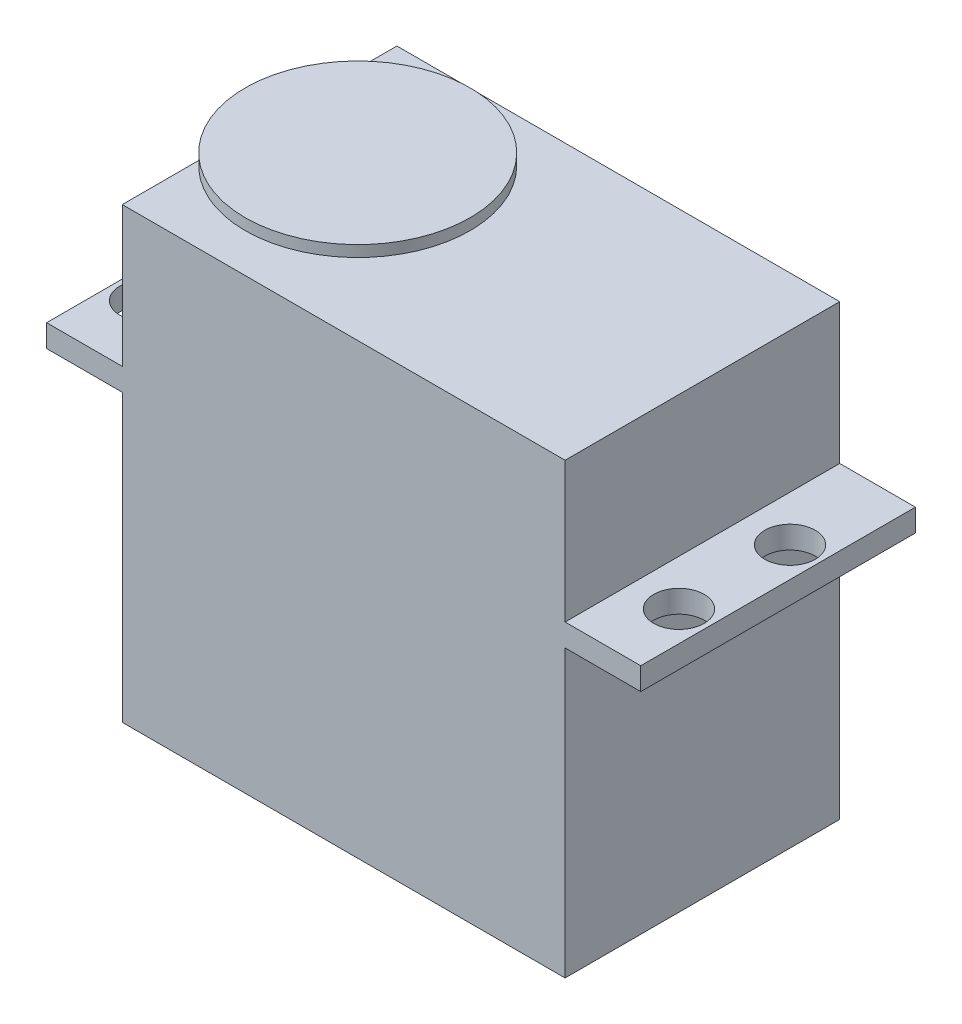
ISO-10303-21;
HEADER;
FILE_DESCRIPTION(('STEP AP214'),'2;1');
FILE_NAME('part.step','',(''),(''),'','','');
FILE_SCHEMA(('AUTOMOTIVE_DESIGN { 1 0 10303 214 1 1 1 1 }'));
ENDSEC;
DATA;
#1=APPLICATION_CONTEXT('core data for automotive mechanical design processes');
#2=APPLICATION_PROTOCOL_DEFINITION('international standard','automotive_design',2000,#1);
#3=PRODUCT_CONTEXT('',#1,'mechanical');
#4=PRODUCT('Part','Part','',(#3));
#5=PRODUCT_RELATED_PRODUCT_CATEGORY('part','',(#4));
#6=PRODUCT_DEFINITION_FORMATION('','',#4);
#7=PRODUCT_DEFINITION_CONTEXT('part definition',#1,'design');
#8=PRODUCT_DEFINITION('design','',#6,#7);
#9=PRODUCT_DEFINITION_SHAPE('','',#8);
#10=(LENGTH_UNIT() NAMED_UNIT(*) SI_UNIT(.MILLI.,.METRE.));
#11=(NAMED_UNIT(*) PLANE_ANGLE_UNIT() SI_UNIT($,.RADIAN.));
#12=(NAMED_UNIT(*) SI_UNIT($,.STERADIAN.) SOLID_ANGLE_UNIT());
#13=UNCERTAINTY_MEASURE_WITH_UNIT(LENGTH_MEASURE(1.E-05),#10,'distance_accuracy_value','');
#14=(GEOMETRIC_REPRESENTATION_CONTEXT(3) GLOBAL_UNCERTAINTY_ASSIGNED_CONTEXT((#13)) GLOBAL_UNIT_ASSIGNED_CONTEXT((#10,
#11,#12)) REPRESENTATION_CONTEXT('',''));
#15=CARTESIAN_POINT('',(0.,0.,0.));
#16=DIRECTION('',(0.,0.,1.));
#17=DIRECTION('',(1.,0.,0.));
#18=AXIS2_PLACEMENT_3D('',#15,#16,#17);
#19=CARTESIAN_POINT('',(-19.75,40.,-12.25));
#20=DIRECTION('',(1.,0.,0.));
#21=DIRECTION('',(0.,0.,-1.));
#22=AXIS2_PLACEMENT_3D('',#19,#20,#21);
#23=PLANE('',#22);
#24=DIRECTION('',(0.,0.,1.));
#25=VECTOR('',#24,1.);
#26=CARTESIAN_POINT('',(-19.75,25.5,-12.25));
#27=LINE('',#26,#25);
#28=CARTESIAN_POINT('',(-19.75,25.5,-12.25));
#29=VERTEX_POINT('',#28);
#30=CARTESIAN_POINT('',(-19.75,25.5,12.25));
#31=VERTEX_POINT('',#30);
#32=EDGE_CURVE('E143',#29,#31,#27,.T.);
#33=ORIENTED_EDGE('',*,*,#32,.F.);
#34=DIRECTION('',(0.,-1.,0.));
#35=VECTOR('',#34,1.);
#36=CARTESIAN_POINT('',(-19.75,40.,-12.25));
#37=LINE('',#36,#35);
#38=CARTESIAN_POINT('',(-19.75,0.,-12.25));
#39=VERTEX_POINT('',#38);
#40=EDGE_CURVE('E193',#29,#39,#37,.T.);
#41=ORIENTED_EDGE('',*,*,#40,.T.);
#42=DIRECTION('',(0.,0.,1.));
#43=VECTOR('',#42,1.);
#44=CARTESIAN_POINT('',(-19.75,0.,-12.25));
#45=LINE('',#44,#43);
#46=CARTESIAN_POINT('',(-19.75,0.,12.25));
#47=VERTEX_POINT('',#46);
#48=EDGE_CURVE('E182',#39,#47,#45,.T.);
#49=ORIENTED_EDGE('',*,*,#48,.T.);
#50=DIRECTION('',(0.,-1.,0.));
#51=VECTOR('',#50,1.);
#52=CARTESIAN_POINT('',(-19.75,40.,12.25));
#53=LINE('',#52,#51);
#54=EDGE_CURVE('E45',#31,#47,#53,.T.);
#55=ORIENTED_EDGE('',*,*,#54,.F.);
#56=EDGE_LOOP('',(#33,#41,#49,#55));
#57=FACE_BOUND('',#56,.T.);
#58=ADVANCED_FACE('F37',(#57),#23,.F.);
#59=CARTESIAN_POINT('',(19.75,40.,-12.25));
#60=DIRECTION('',(-1.,0.,0.));
#61=DIRECTION('',(0.,0.,1.));
#62=AXIS2_PLACEMENT_3D('',#59,#60,#61);
#63=PLANE('',#62);
#64=DIRECTION('',(0.,0.,-1.));
#65=VECTOR('',#64,1.);
#66=CARTESIAN_POINT('',(19.75,25.5,-12.25));
#67=LINE('',#66,#65);
#68=CARTESIAN_POINT('',(19.75,25.5,12.25));
#69=VERTEX_POINT('',#68);
#70=CARTESIAN_POINT('',(19.75,25.5,-12.25));
#71=VERTEX_POINT('',#70);
#72=EDGE_CURVE('E179',#69,#71,#67,.T.);
#73=ORIENTED_EDGE('',*,*,#72,.F.);
#74=DIRECTION('',(0.,-1.,0.));
#75=VECTOR('',#74,1.);
#76=CARTESIAN_POINT('',(19.75,40.,12.25));
#77=LINE('',#76,#75);
#78=CARTESIAN_POINT('',(19.75,0.,12.25));
#79=VERTEX_POINT('',#78);
#80=EDGE_CURVE('E210',#69,#79,#77,.T.);
#81=ORIENTED_EDGE('',*,*,#80,.T.);
#82=DIRECTION('',(0.,0.,-1.));
#83=VECTOR('',#82,1.);
#84=CARTESIAN_POINT('',(19.75,0.,-12.25));
#85=LINE('',#84,#83);
#86=CARTESIAN_POINT('',(19.75,0.,-12.25));
#87=VERTEX_POINT('',#86);
#88=EDGE_CURVE('E199',#79,#87,#85,.T.);
#89=ORIENTED_EDGE('',*,*,#88,.T.);
#90=DIRECTION('',(0.,-1.,0.));
#91=VECTOR('',#90,1.);
#92=CARTESIAN_POINT('',(19.75,40.,-12.25));
#93=LINE('',#92,#91);
#94=EDGE_CURVE('E207',#71,#87,#93,.T.);
#95=ORIENTED_EDGE('',*,*,#94,.F.);
#96=EDGE_LOOP('',(#73,#81,#89,#95));
#97=FACE_BOUND('',#96,.T.);
#98=ADVANCED_FACE('F219',(#97),#63,.F.);
#99=CARTESIAN_POINT('',(-19.75,40.,-12.25));
#100=VERTEX_POINT('',#99);
#101=CARTESIAN_POINT('',(-19.75,27.5,-12.25));
#102=VERTEX_POINT('',#101);
#103=EDGE_CURVE('E204',#100,#102,#37,.T.);
#104=ORIENTED_EDGE('',*,*,#103,.T.);
#105=DIRECTION('',(0.,0.,1.));
#106=VECTOR('',#105,1.);
#107=CARTESIAN_POINT('',(-19.75,27.5,-12.25));
#108=LINE('',#107,#106);
#109=CARTESIAN_POINT('',(-19.75,27.5,12.25));
#110=VERTEX_POINT('',#109);
#111=EDGE_CURVE('E177',#102,#110,#108,.T.);
#112=ORIENTED_EDGE('',*,*,#111,.T.);
#113=CARTESIAN_POINT('',(-19.75,40.,12.25));
#114=VERTEX_POINT('',#113);
#115=EDGE_CURVE('E11',#114,#110,#53,.T.);
#116=ORIENTED_EDGE('',*,*,#115,.F.);
#117=DIRECTION('',(0.,0.,1.));
#118=VECTOR('',#117,1.);
#119=CARTESIAN_POINT('',(-19.75,40.,-12.25));
#120=LINE('',#119,#118);
#121=EDGE_CURVE('E183',#100,#114,#120,.T.);
#122=ORIENTED_EDGE('',*,*,#121,.F.);
#123=EDGE_LOOP('',(#104,#112,#116,#122));
#124=FACE_BOUND('',#123,.T.);
#125=ADVANCED_FACE('F39',(#124),#23,.F.);
#126=CARTESIAN_POINT('',(-19.75,40.,12.25));
#127=DIRECTION('',(0.,0.,-1.));
#128=DIRECTION('',(-1.,0.,0.));
#129=AXIS2_PLACEMENT_3D('',#126,#127,#128);
#130=PLANE('',#129);
#131=ORIENTED_EDGE('',*,*,#115,.T.);
#132=DIRECTION('',(1.,0.,0.));
#133=VECTOR('',#132,1.);
#134=CARTESIAN_POINT('',(-26.5,27.5,12.25));
#135=LINE('',#134,#133);
#136=CARTESIAN_POINT('',(-26.5,27.5,12.25));
#137=VERTEX_POINT('',#136);
#138=EDGE_CURVE('E52',#137,#110,#135,.T.);
#139=ORIENTED_EDGE('',*,*,#138,.F.);
#140=DIRECTION('',(0.,1.,0.));
#141=VECTOR('',#140,1.);
#142=CARTESIAN_POINT('',(-26.5,25.5,12.25));
#143=LINE('',#142,#141);
#144=CARTESIAN_POINT('',(-26.5,25.5,12.25));
#145=VERTEX_POINT('',#144);
#146=EDGE_CURVE('E127',#145,#137,#143,.T.);
#147=ORIENTED_EDGE('',*,*,#146,.F.);
#148=DIRECTION('',(1.,0.,0.));
#149=VECTOR('',#148,1.);
#150=CARTESIAN_POINT('',(-26.5,25.5,12.25));
#151=LINE('',#150,#149);
#152=EDGE_CURVE('E130',#145,#31,#151,.T.);
#153=ORIENTED_EDGE('',*,*,#152,.T.);
#154=ORIENTED_EDGE('',*,*,#54,.T.);
#155=DIRECTION('',(1.,0.,0.));
#156=VECTOR('',#155,1.);
#157=CARTESIAN_POINT('',(-19.75,0.,12.25));
#158=LINE('',#157,#156);
#159=EDGE_CURVE('E196',#47,#79,#158,.T.);
#160=ORIENTED_EDGE('',*,*,#159,.T.);
#161=ORIENTED_EDGE('',*,*,#80,.F.);
#162=CARTESIAN_POINT('',(26.5,25.5,12.25));
#163=VERTEX_POINT('',#162);
#164=EDGE_CURVE('E145',#69,#163,#151,.T.);
#165=ORIENTED_EDGE('',*,*,#164,.T.);
#166=DIRECTION('',(0.,1.,0.));
#167=VECTOR('',#166,1.);
#168=CARTESIAN_POINT('',(26.5,25.5,12.25));
#169=LINE('',#168,#167);
#170=CARTESIAN_POINT('',(26.5,27.5,12.25));
#171=VERTEX_POINT('',#170);
#172=EDGE_CURVE('E135',#163,#171,#169,.T.);
#173=ORIENTED_EDGE('',*,*,#172,.T.);
#174=CARTESIAN_POINT('',(19.75,27.5,12.25));
#175=VERTEX_POINT('',#174);
#176=EDGE_CURVE('E165',#175,#171,#135,.T.);
#177=ORIENTED_EDGE('',*,*,#176,.F.);
#178=CARTESIAN_POINT('',(19.75,40.,12.25));
#179=VERTEX_POINT('',#178);
#180=EDGE_CURVE('E211',#179,#175,#77,.T.);
#181=ORIENTED_EDGE('',*,*,#180,.F.);
#182=DIRECTION('',(1.,0.,0.));
#183=VECTOR('',#182,1.);
#184=CARTESIAN_POINT('',(-19.75,40.,12.25));
#185=LINE('',#184,#183);
#186=EDGE_CURVE('E186',#114,#179,#185,.T.);
#187=ORIENTED_EDGE('',*,*,#186,.F.);
#188=EDGE_LOOP('',(#131,#139,#147,#153,#154,#160,#161,#165,#173,#177,#181,#187));
#189=FACE_BOUND('',#188,.T.);
#190=ADVANCED_FACE('F129',(#189),#130,.F.);
#191=ORIENTED_EDGE('',*,*,#180,.T.);
#192=DIRECTION('',(0.,0.,-1.));
#193=VECTOR('',#192,1.);
#194=CARTESIAN_POINT('',(19.75,27.5,-12.25));
#195=LINE('',#194,#193);
#196=CARTESIAN_POINT('',(19.75,27.5,-12.25));
#197=VERTEX_POINT('',#196);
#198=EDGE_CURVE('E171',#175,#197,#195,.T.);
#199=ORIENTED_EDGE('',*,*,#198,.T.);
#200=CARTESIAN_POINT('',(19.75,40.,-12.25));
#201=VERTEX_POINT('',#200);
#202=EDGE_CURVE('E208',#201,#197,#93,.T.);
#203=ORIENTED_EDGE('',*,*,#202,.F.);
#204=DIRECTION('',(0.,0.,-1.));
#205=VECTOR('',#204,1.);
#206=CARTESIAN_POINT('',(19.75,40.,-12.25));
#207=LINE('',#206,#205);
#208=EDGE_CURVE('E189',#179,#201,#207,.T.);
#209=ORIENTED_EDGE('',*,*,#208,.F.);
#210=EDGE_LOOP('',(#191,#199,#203,#209));
#211=FACE_BOUND('',#210,.T.);
#212=ADVANCED_FACE('F243',(#211),#63,.F.);
#213=CARTESIAN_POINT('',(-19.75,40.,-12.25));
#214=DIRECTION('',(0.,0.,1.));
#215=DIRECTION('',(1.,0.,0.));
#216=AXIS2_PLACEMENT_3D('',#213,#214,#215);
#217=PLANE('',#216);
#218=ORIENTED_EDGE('',*,*,#202,.T.);
#219=DIRECTION('',(-1.,0.,0.));
#220=VECTOR('',#219,1.);
#221=CARTESIAN_POINT('',(-26.5,27.5,-12.25));
#222=LINE('',#221,#220);
#223=CARTESIAN_POINT('',(26.5,27.5,-12.25));
#224=VERTEX_POINT('',#223);
#225=EDGE_CURVE('E60',#224,#197,#222,.T.);
#226=ORIENTED_EDGE('',*,*,#225,.F.);
#227=DIRECTION('',(0.,1.,0.));
#228=VECTOR('',#227,1.);
#229=CARTESIAN_POINT('',(26.5,25.5,-12.25));
#230=LINE('',#229,#228);
#231=CARTESIAN_POINT('',(26.5,25.5,-12.25));
#232=VERTEX_POINT('',#231);
#233=EDGE_CURVE('E172',#232,#224,#230,.T.);
#234=ORIENTED_EDGE('',*,*,#233,.F.);
#235=DIRECTION('',(-1.,0.,0.));
#236=VECTOR('',#235,1.);
#237=CARTESIAN_POINT('',(-26.5,25.5,-12.25));
#238=LINE('',#237,#236);
#239=EDGE_CURVE('E136',#232,#71,#238,.T.);
#240=ORIENTED_EDGE('',*,*,#239,.T.);
#241=ORIENTED_EDGE('',*,*,#94,.T.);
#242=DIRECTION('',(-1.,0.,0.));
#243=VECTOR('',#242,1.);
#244=CARTESIAN_POINT('',(-19.75,0.,-12.25));
#245=LINE('',#244,#243);
#246=EDGE_CURVE('E187',#87,#39,#245,.T.);
#247=ORIENTED_EDGE('',*,*,#246,.T.);
#248=ORIENTED_EDGE('',*,*,#40,.F.);
#249=CARTESIAN_POINT('',(-26.5,25.5,-12.25));
#250=VERTEX_POINT('',#249);
#251=EDGE_CURVE('E160',#29,#250,#238,.T.);
#252=ORIENTED_EDGE('',*,*,#251,.T.);
#253=DIRECTION('',(0.,1.,0.));
#254=VECTOR('',#253,1.);
#255=CARTESIAN_POINT('',(-26.5,25.5,-12.25));
#256=LINE('',#255,#254);
#257=CARTESIAN_POINT('',(-26.5,27.5,-12.25));
#258=VERTEX_POINT('',#257);
#259=EDGE_CURVE('E150',#250,#258,#256,.T.);
#260=ORIENTED_EDGE('',*,*,#259,.T.);
#261=EDGE_CURVE('E152',#102,#258,#222,.T.);
#262=ORIENTED_EDGE('',*,*,#261,.F.);
#263=ORIENTED_EDGE('',*,*,#103,.F.);
#264=DIRECTION('',(-1.,0.,0.));
#265=VECTOR('',#264,1.);
#266=CARTESIAN_POINT('',(-19.75,40.,-12.25));
#267=LINE('',#266,#265);
#268=EDGE_CURVE('E191',#201,#100,#267,.T.);
#269=ORIENTED_EDGE('',*,*,#268,.F.);
#270=EDGE_LOOP('',(#218,#226,#234,#240,#241,#247,#248,#252,#260,#262,#263,#269));
#271=FACE_BOUND('',#270,.T.);
#272=ADVANCED_FACE('F229',(#271),#217,.F.);
#273=CARTESIAN_POINT('',(0.,40.,0.));
#274=DIRECTION('',(0.,1.,0.));
#275=DIRECTION('',(0.,0.,1.));
#276=AXIS2_PLACEMENT_3D('',#273,#274,#275);
#277=PLANE('',#276);
#278=CARTESIAN_POINT('',(-9.25,40.,1.75));
#279=DIRECTION('',(0.,1.,0.));
#280=DIRECTION('',(0.,0.,1.));
#281=AXIS2_PLACEMENT_3D('',#278,#279,#280);
#282=CIRCLE('',#281,2.5);
#283=CARTESIAN_POINT('',(-9.25,40.,4.25));
#284=VERTEX_POINT('',#283);
#285=EDGE_CURVE('E318',#284,#284,#282,.T.);
#286=ORIENTED_EDGE('',*,*,#285,.F.);
#287=EDGE_LOOP('',(#286));
#288=FACE_BOUND('',#287,.T.);
#289=ORIENTED_EDGE('',*,*,#121,.T.);
#290=ORIENTED_EDGE('',*,*,#186,.T.);
#291=ORIENTED_EDGE('',*,*,#208,.T.);
#292=ORIENTED_EDGE('',*,*,#268,.T.);
#293=EDGE_LOOP('',(#289,#290,#291,#292));
#294=FACE_BOUND('',#293,.T.);
#295=ADVANCED_FACE('F247',(#288,#294),#277,.T.);
#296=CARTESIAN_POINT('',(0.,0.,0.));
#297=DIRECTION('',(0.,1.,0.));
#298=DIRECTION('',(0.,0.,1.));
#299=AXIS2_PLACEMENT_3D('',#296,#297,#298);
#300=PLANE('',#299);
#301=ORIENTED_EDGE('',*,*,#48,.F.);
#302=ORIENTED_EDGE('',*,*,#246,.F.);
#303=ORIENTED_EDGE('',*,*,#88,.F.);
#304=ORIENTED_EDGE('',*,*,#159,.F.);
#305=EDGE_LOOP('',(#301,#302,#303,#304));
#306=FACE_BOUND('',#305,.T.);
#307=ADVANCED_FACE('F226',(#306),#300,.F.);
#308=CARTESIAN_POINT('',(26.5,25.5,-12.25));
#309=DIRECTION('',(1.,0.,0.));
#310=DIRECTION('',(0.,0.,-1.));
#311=AXIS2_PLACEMENT_3D('',#308,#309,#310);
#312=PLANE('',#311);
#313=DIRECTION('',(0.,0.,-1.));
#314=VECTOR('',#313,1.);
#315=CARTESIAN_POINT('',(26.5,27.5,-12.25));
#316=LINE('',#315,#314);
#317=EDGE_CURVE('E168',#171,#224,#316,.T.);
#318=ORIENTED_EDGE('',*,*,#317,.F.);
#319=ORIENTED_EDGE('',*,*,#172,.F.);
#320=DIRECTION('',(0.,0.,-1.));
#321=VECTOR('',#320,1.);
#322=CARTESIAN_POINT('',(26.5,25.5,-12.25));
#323=LINE('',#322,#321);
#324=EDGE_CURVE('E144',#163,#232,#323,.T.);
#325=ORIENTED_EDGE('',*,*,#324,.T.);
#326=ORIENTED_EDGE('',*,*,#233,.T.);
#327=EDGE_LOOP('',(#318,#319,#325,#326));
#328=FACE_BOUND('',#327,.T.);
#329=ADVANCED_FACE('F238',(#328),#312,.T.);
#330=CARTESIAN_POINT('',(0.,27.5,0.));
#331=DIRECTION('',(0.,1.,0.));
#332=DIRECTION('',(0.,0.,1.));
#333=AXIS2_PLACEMENT_3D('',#330,#331,#332);
#334=PLANE('',#333);
#335=CARTESIAN_POINT('',(23.814,27.5,-3.752));
#336=DIRECTION('',(0.,1.,0.));
#337=DIRECTION('',(0.,0.,1.));
#338=AXIS2_PLACEMENT_3D('',#335,#336,#337);
#339=CIRCLE('',#338,2.25);
#340=CARTESIAN_POINT('',(23.814,27.5,-1.502));
#341=VERTEX_POINT('',#340);
#342=EDGE_CURVE('E342',#341,#341,#339,.T.);
#343=ORIENTED_EDGE('',*,*,#342,.F.);
#344=EDGE_LOOP('',(#343));
#345=FACE_BOUND('',#344,.T.);
#346=CARTESIAN_POINT('',(23.814,27.5,6.154));
#347=DIRECTION('',(0.,1.,0.));
#348=DIRECTION('',(0.,0.,1.));
#349=AXIS2_PLACEMENT_3D('',#346,#347,#348);
#350=CIRCLE('',#349,2.25);
#351=CARTESIAN_POINT('',(23.814,27.5,8.404));
#352=VERTEX_POINT('',#351);
#353=EDGE_CURVE('E330',#352,#352,#350,.T.);
#354=ORIENTED_EDGE('',*,*,#353,.F.);
#355=EDGE_LOOP('',(#354));
#356=FACE_BOUND('',#355,.T.);
#357=ORIENTED_EDGE('',*,*,#198,.F.);
#358=ORIENTED_EDGE('',*,*,#176,.T.);
#359=ORIENTED_EDGE('',*,*,#317,.T.);
#360=ORIENTED_EDGE('',*,*,#225,.T.);
#361=EDGE_LOOP('',(#357,#358,#359,#360));
#362=FACE_BOUND('',#361,.T.);
#363=ADVANCED_FACE('F239',(#345,#356,#362),#334,.T.);
#364=CARTESIAN_POINT('',(0.,25.5,0.));
#365=DIRECTION('',(0.,1.,0.));
#366=DIRECTION('',(0.,0.,1.));
#367=AXIS2_PLACEMENT_3D('',#364,#365,#366);
#368=PLANE('',#367);
#369=CARTESIAN_POINT('',(23.814,25.5,-3.752));
#370=DIRECTION('',(0.,1.,0.));
#371=DIRECTION('',(0.,0.,1.));
#372=AXIS2_PLACEMENT_3D('',#369,#370,#371);
#373=CIRCLE('',#372,2.25);
#374=CARTESIAN_POINT('',(23.814,25.5,-1.502));
#375=VERTEX_POINT('',#374);
#376=EDGE_CURVE('E333',#375,#375,#373,.T.);
#377=ORIENTED_EDGE('',*,*,#376,.T.);
#378=EDGE_LOOP('',(#377));
#379=FACE_BOUND('',#378,.T.);
#380=CARTESIAN_POINT('',(23.814,25.5,6.154));
#381=DIRECTION('',(0.,1.,0.));
#382=DIRECTION('',(0.,0.,1.));
#383=AXIS2_PLACEMENT_3D('',#380,#381,#382);
#384=CIRCLE('',#383,2.25);
#385=CARTESIAN_POINT('',(23.814,25.5,8.404));
#386=VERTEX_POINT('',#385);
#387=EDGE_CURVE('E328',#386,#386,#384,.T.);
#388=ORIENTED_EDGE('',*,*,#387,.T.);
#389=EDGE_LOOP('',(#388));
#390=FACE_BOUND('',#389,.T.);
#391=ORIENTED_EDGE('',*,*,#164,.F.);
#392=ORIENTED_EDGE('',*,*,#72,.T.);
#393=ORIENTED_EDGE('',*,*,#239,.F.);
#394=ORIENTED_EDGE('',*,*,#324,.F.);
#395=EDGE_LOOP('',(#391,#392,#393,#394));
#396=FACE_BOUND('',#395,.T.);
#397=ADVANCED_FACE('F233',(#379,#390,#396),#368,.F.);
#398=CARTESIAN_POINT('',(-23.814,25.5,6.154));
#399=DIRECTION('',(0.,1.,0.));
#400=DIRECTION('',(0.,0.,1.));
#401=AXIS2_PLACEMENT_3D('',#398,#399,#400);
#402=CIRCLE('',#401,2.25);
#403=CARTESIAN_POINT('',(-23.814,25.5,8.404));
#404=VERTEX_POINT('',#403);
#405=EDGE_CURVE('E339',#404,#404,#402,.T.);
#406=ORIENTED_EDGE('',*,*,#405,.T.);
#407=EDGE_LOOP('',(#406));
#408=FACE_BOUND('',#407,.T.);
#409=CARTESIAN_POINT('',(-23.814,25.5,-3.752));
#410=DIRECTION('',(0.,1.,0.));
#411=DIRECTION('',(0.,0.,1.));
#412=AXIS2_PLACEMENT_3D('',#409,#410,#411);
#413=CIRCLE('',#412,2.25);
#414=CARTESIAN_POINT('',(-23.814,25.5,-1.502));
#415=VERTEX_POINT('',#414);
#416=EDGE_CURVE('E166',#415,#415,#413,.T.);
#417=ORIENTED_EDGE('',*,*,#416,.T.);
#418=EDGE_LOOP('',(#417));
#419=FACE_BOUND('',#418,.T.);
#420=ORIENTED_EDGE('',*,*,#251,.F.);
#421=ORIENTED_EDGE('',*,*,#32,.T.);
#422=ORIENTED_EDGE('',*,*,#152,.F.);
#423=DIRECTION('',(0.,0.,1.));
#424=VECTOR('',#423,1.);
#425=CARTESIAN_POINT('',(-26.5,25.5,-12.25));
#426=LINE('',#425,#424);
#427=EDGE_CURVE('E141',#250,#145,#426,.T.);
#428=ORIENTED_EDGE('',*,*,#427,.F.);
#429=EDGE_LOOP('',(#420,#421,#422,#428));
#430=FACE_BOUND('',#429,.T.);
#431=ADVANCED_FACE('F140',(#408,#419,#430),#368,.F.);
#432=CARTESIAN_POINT('',(-23.814,27.5,6.154));
#433=DIRECTION('',(0.,1.,0.));
#434=DIRECTION('',(0.,0.,1.));
#435=AXIS2_PLACEMENT_3D('',#432,#433,#434);
#436=CIRCLE('',#435,2.25);
#437=CARTESIAN_POINT('',(-23.814,27.5,8.404));
#438=VERTEX_POINT('',#437);
#439=EDGE_CURVE('E336',#438,#438,#436,.T.);
#440=ORIENTED_EDGE('',*,*,#439,.F.);
#441=EDGE_LOOP('',(#440));
#442=FACE_BOUND('',#441,.T.);
#443=CARTESIAN_POINT('',(-23.814,27.5,-3.752));
#444=DIRECTION('',(0.,1.,0.));
#445=DIRECTION('',(0.,0.,1.));
#446=AXIS2_PLACEMENT_3D('',#443,#444,#445);
#447=CIRCLE('',#446,2.25);
#448=CARTESIAN_POINT('',(-23.814,27.5,-1.502));
#449=VERTEX_POINT('',#448);
#450=EDGE_CURVE('E155',#449,#449,#447,.T.);
#451=ORIENTED_EDGE('',*,*,#450,.F.);
#452=EDGE_LOOP('',(#451));
#453=FACE_BOUND('',#452,.T.);
#454=ORIENTED_EDGE('',*,*,#111,.F.);
#455=ORIENTED_EDGE('',*,*,#261,.T.);
#456=DIRECTION('',(0.,0.,1.));
#457=VECTOR('',#456,1.);
#458=CARTESIAN_POINT('',(-26.5,27.5,-12.25));
#459=LINE('',#458,#457);
#460=EDGE_CURVE('E163',#258,#137,#459,.T.);
#461=ORIENTED_EDGE('',*,*,#460,.T.);
#462=ORIENTED_EDGE('',*,*,#138,.T.);
#463=EDGE_LOOP('',(#454,#455,#461,#462));
#464=FACE_BOUND('',#463,.T.);
#465=ADVANCED_FACE('F250',(#442,#453,#464),#334,.T.);
#466=CARTESIAN_POINT('',(-26.5,25.5,-12.25));
#467=DIRECTION('',(-1.,0.,0.));
#468=DIRECTION('',(0.,0.,1.));
#469=AXIS2_PLACEMENT_3D('',#466,#467,#468);
#470=PLANE('',#469);
#471=ORIENTED_EDGE('',*,*,#460,.F.);
#472=ORIENTED_EDGE('',*,*,#259,.F.);
#473=ORIENTED_EDGE('',*,*,#427,.T.);
#474=ORIENTED_EDGE('',*,*,#146,.T.);
#475=EDGE_LOOP('',(#471,#472,#473,#474));
#476=FACE_BOUND('',#475,.T.);
#477=ADVANCED_FACE('F148',(#476),#470,.T.);
#478=CARTESIAN_POINT('',(-23.814,25.5,-3.752));
#479=DIRECTION('',(0.,1.,0.));
#480=DIRECTION('',(0.,0.,1.));
#481=AXIS2_PLACEMENT_3D('',#478,#479,#480);
#482=CYLINDRICAL_SURFACE('',#481,2.25);
#483=ORIENTED_EDGE('',*,*,#416,.F.);
#484=EDGE_LOOP('',(#483));
#485=FACE_BOUND('',#484,.T.);
#486=ORIENTED_EDGE('',*,*,#450,.T.);
#487=EDGE_LOOP('',(#486));
#488=FACE_BOUND('',#487,.T.);
#489=ADVANCED_FACE('F274',(#485,#488),#482,.F.);
#490=CARTESIAN_POINT('',(-23.814,25.5,6.154));
#491=DIRECTION('',(0.,1.,0.));
#492=DIRECTION('',(0.,0.,1.));
#493=AXIS2_PLACEMENT_3D('',#490,#491,#492);
#494=CYLINDRICAL_SURFACE('',#493,2.25);
#495=ORIENTED_EDGE('',*,*,#405,.F.);
#496=EDGE_LOOP('',(#495));
#497=FACE_BOUND('',#496,.T.);
#498=ORIENTED_EDGE('',*,*,#439,.T.);
#499=EDGE_LOOP('',(#498));
#500=FACE_BOUND('',#499,.T.);
#501=ADVANCED_FACE('F285',(#497,#500),#494,.F.);
#502=CARTESIAN_POINT('',(23.814,25.5,6.154));
#503=DIRECTION('',(0.,1.,0.));
#504=DIRECTION('',(0.,0.,1.));
#505=AXIS2_PLACEMENT_3D('',#502,#503,#504);
#506=CYLINDRICAL_SURFACE('',#505,2.25);
#507=ORIENTED_EDGE('',*,*,#387,.F.);
#508=EDGE_LOOP('',(#507));
#509=FACE_BOUND('',#508,.T.);
#510=ORIENTED_EDGE('',*,*,#353,.T.);
#511=EDGE_LOOP('',(#510));
#512=FACE_BOUND('',#511,.T.);
#513=ADVANCED_FACE('F291',(#509,#512),#506,.F.);
#514=CARTESIAN_POINT('',(23.814,25.5,-3.752));
#515=DIRECTION('',(0.,1.,0.));
#516=DIRECTION('',(0.,0.,1.));
#517=AXIS2_PLACEMENT_3D('',#514,#515,#516);
#518=CYLINDRICAL_SURFACE('',#517,2.25);
#519=ORIENTED_EDGE('',*,*,#376,.F.);
#520=EDGE_LOOP('',(#519));
#521=FACE_BOUND('',#520,.T.);
#522=ORIENTED_EDGE('',*,*,#342,.T.);
#523=EDGE_LOOP('',(#522));
#524=FACE_BOUND('',#523,.T.);
#525=ADVANCED_FACE('F287',(#521,#524),#518,.F.);
#526=CARTESIAN_POINT('',(-9.25,43.,1.75));
#527=DIRECTION('',(0.,-1.,0.));
#528=DIRECTION('',(0.,0.,-1.));
#529=AXIS2_PLACEMENT_3D('',#526,#527,#528);
#530=CYLINDRICAL_SURFACE('',#529,2.5);
#531=CARTESIAN_POINT('',(-9.25,43.,1.75));
#532=DIRECTION('',(0.,1.,0.));
#533=DIRECTION('',(0.,0.,1.));
#534=AXIS2_PLACEMENT_3D('',#531,#532,#533);
#535=CIRCLE('',#534,2.5);
#536=CARTESIAN_POINT('',(-9.25,43.,4.25));
#537=VERTEX_POINT('',#536);
#538=EDGE_CURVE('E322',#537,#537,#535,.T.);
#539=ORIENTED_EDGE('',*,*,#538,.F.);
#540=EDGE_LOOP('',(#539));
#541=FACE_BOUND('',#540,.T.);
#542=ORIENTED_EDGE('',*,*,#285,.T.);
#543=EDGE_LOOP('',(#542));
#544=FACE_BOUND('',#543,.T.);
#545=ADVANCED_FACE('F290',(#541,#544),#530,.T.);
#546=CARTESIAN_POINT('',(-9.25,44.,1.75));
#547=DIRECTION('',(0.,-1.,0.));
#548=DIRECTION('',(0.,0.,-1.));
#549=AXIS2_PLACEMENT_3D('',#546,#547,#548);
#550=CYLINDRICAL_SURFACE('',#549,10.033);
#551=CARTESIAN_POINT('',(-9.25,44.,1.75));
#552=DIRECTION('',(0.,1.,0.));
#553=DIRECTION('',(0.,0.,1.));
#554=AXIS2_PLACEMENT_3D('',#551,#552,#553);
#555=CIRCLE('',#554,10.033);
#556=CARTESIAN_POINT('',(-9.25,44.,11.783));
#557=VERTEX_POINT('',#556);
#558=EDGE_CURVE('E317',#557,#557,#555,.T.);
#559=ORIENTED_EDGE('',*,*,#558,.F.);
#560=EDGE_LOOP('',(#559));
#561=FACE_BOUND('',#560,.T.);
#562=CARTESIAN_POINT('',(-9.25,43.,1.75));
#563=DIRECTION('',(0.,1.,0.));
#564=DIRECTION('',(0.,0.,1.));
#565=AXIS2_PLACEMENT_3D('',#562,#563,#564);
#566=CIRCLE('',#565,10.033);
#567=CARTESIAN_POINT('',(-9.25,43.,11.783));
#568=VERTEX_POINT('',#567);
#569=EDGE_CURVE('E319',#568,#568,#566,.T.);
#570=ORIENTED_EDGE('',*,*,#569,.T.);
#571=EDGE_LOOP('',(#570));
#572=FACE_BOUND('',#571,.T.);
#573=ADVANCED_FACE('F301',(#561,#572),#550,.T.);
#574=CARTESIAN_POINT('',(-9.25,44.,1.75));
#575=DIRECTION('',(0.,1.,0.));
#576=DIRECTION('',(0.,0.,1.));
#577=AXIS2_PLACEMENT_3D('',#574,#575,#576);
#578=PLANE('',#577);
#579=ORIENTED_EDGE('',*,*,#558,.T.);
#580=EDGE_LOOP('',(#579));
#581=FACE_BOUND('',#580,.T.);
#582=ADVANCED_FACE('F305',(#581),#578,.T.);
#583=CARTESIAN_POINT('',(-9.25,43.,1.75));
#584=DIRECTION('',(0.,1.,0.));
#585=DIRECTION('',(0.,0.,1.));
#586=AXIS2_PLACEMENT_3D('',#583,#584,#585);
#587=PLANE('',#586);
#588=ORIENTED_EDGE('',*,*,#538,.T.);
#589=EDGE_LOOP('',(#588));
#590=FACE_BOUND('',#589,.T.);
#591=ORIENTED_EDGE('',*,*,#569,.F.);
#592=EDGE_LOOP('',(#591));
#593=FACE_BOUND('',#592,.T.);
#594=ADVANCED_FACE('F307',(#590,#593),#587,.F.);
#595=CLOSED_SHELL('',(#58,#98,#125,#190,#212,#272,#295,#307,#329,#363,#397,#431,#465,#477,#489,
#501,#513,#525,#545,#573,#582,#594));
#596=MANIFOLD_SOLID_BREP('B2',#595);
#597=ADVANCED_BREP_SHAPE_REPRESENTATION('',(#18,#596),#14);
#598=SHAPE_DEFINITION_REPRESENTATION(#9,#597);
ENDSEC;
END-ISO-10303-21;
